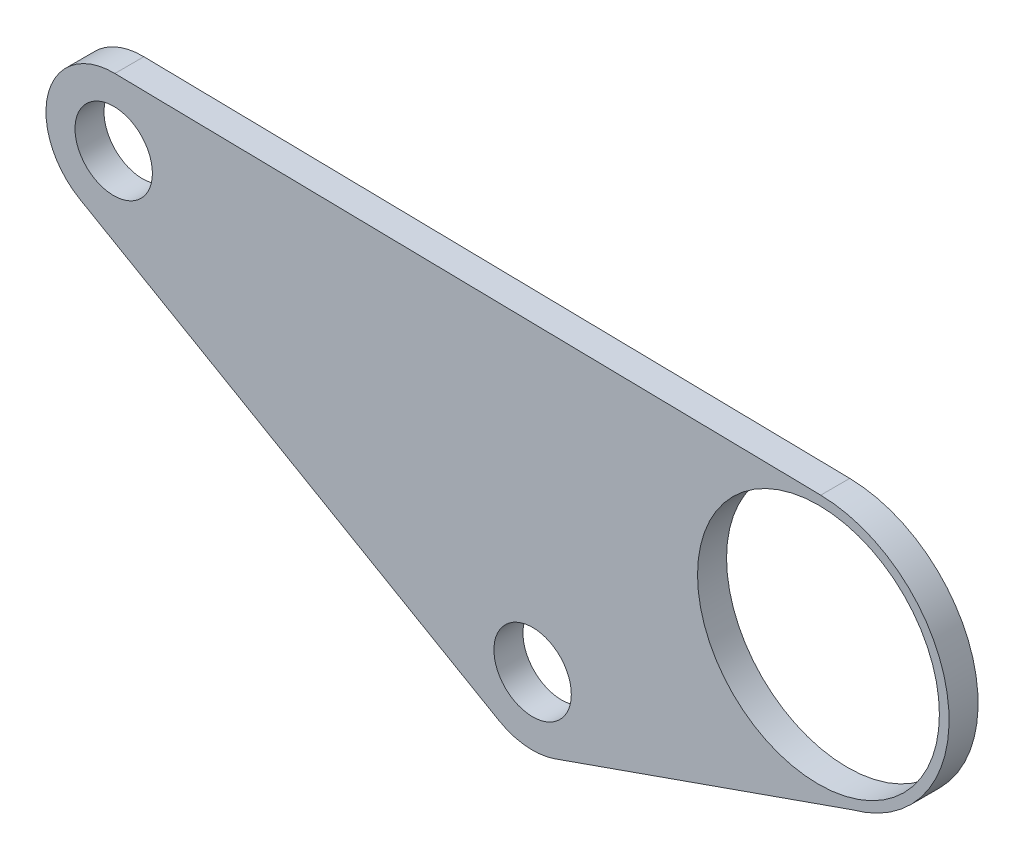
ISO-10303-21;
HEADER;
FILE_DESCRIPTION(('STEP AP214'),'2;1');
FILE_NAME('part.step','',(''),(''),'','','');
FILE_SCHEMA(('AUTOMOTIVE_DESIGN { 1 0 10303 214 1 1 1 1 }'));
ENDSEC;
DATA;
#1=APPLICATION_CONTEXT('core data for automotive mechanical design processes');
#2=APPLICATION_PROTOCOL_DEFINITION('international standard','automotive_design',2000,#1);
#3=PRODUCT_CONTEXT('',#1,'mechanical');
#4=PRODUCT('Part','Part','',(#3));
#5=PRODUCT_RELATED_PRODUCT_CATEGORY('part','',(#4));
#6=PRODUCT_DEFINITION_FORMATION('','',#4);
#7=PRODUCT_DEFINITION_CONTEXT('part definition',#1,'design');
#8=PRODUCT_DEFINITION('design','',#6,#7);
#9=PRODUCT_DEFINITION_SHAPE('','',#8);
#10=(LENGTH_UNIT() NAMED_UNIT(*) SI_UNIT(.MILLI.,.METRE.));
#11=(NAMED_UNIT(*) PLANE_ANGLE_UNIT() SI_UNIT($,.RADIAN.));
#12=(NAMED_UNIT(*) SI_UNIT($,.STERADIAN.) SOLID_ANGLE_UNIT());
#13=UNCERTAINTY_MEASURE_WITH_UNIT(LENGTH_MEASURE(1.E-05),#10,'distance_accuracy_value','');
#14=(GEOMETRIC_REPRESENTATION_CONTEXT(3) GLOBAL_UNCERTAINTY_ASSIGNED_CONTEXT((#13)) GLOBAL_UNIT_ASSIGNED_CONTEXT((#10,
#11,#12)) REPRESENTATION_CONTEXT('',''));
#15=CARTESIAN_POINT('',(0.,0.,0.));
#16=DIRECTION('',(0.,0.,1.));
#17=DIRECTION('',(1.,0.,0.));
#18=AXIS2_PLACEMENT_3D('',#15,#16,#17);
#19=CARTESIAN_POINT('',(83.5750083714108,-201.607395124083,-640.));
#20=DIRECTION('',(0.,0.,-1.));
#21=DIRECTION('',(1.,0.,0.));
#22=AXIS2_PLACEMENT_3D('',#19,#20,#21);
#23=CYLINDRICAL_SURFACE('',#22,6.99999999999999);
#24=CARTESIAN_POINT('',(83.5750083714108,-201.607395124083,-643.));
#25=DIRECTION('',(0.,0.,1.));
#26=DIRECTION('',(1.,0.,0.));
#27=AXIS2_PLACEMENT_3D('',#24,#25,#26);
#28=CIRCLE('',#27,6.99999999999999);
#29=CARTESIAN_POINT('',(83.6965127444625,-194.608449725859,-643.));
#30=VERTEX_POINT('',#29);
#31=CARTESIAN_POINT('',(80.0750083714108,-207.669572950574,-643.));
#32=VERTEX_POINT('',#31);
#33=EDGE_CURVE('E132',#30,#32,#28,.T.);
#34=ORIENTED_EDGE('',*,*,#33,.T.);
#35=DIRECTION('',(0.,0.,-1.));
#36=VECTOR('',#35,1.);
#37=CARTESIAN_POINT('',(80.0750083714108,-207.669572950574,-640.));
#38=LINE('',#37,#36);
#39=CARTESIAN_POINT('',(80.0750083714108,-207.669572950574,-640.));
#40=VERTEX_POINT('',#39);
#41=EDGE_CURVE('E44',#40,#32,#38,.T.);
#42=ORIENTED_EDGE('',*,*,#41,.F.);
#43=CARTESIAN_POINT('',(83.5750083714108,-201.607395124083,-640.));
#44=DIRECTION('',(0.,0.,1.));
#45=DIRECTION('',(1.,0.,0.));
#46=AXIS2_PLACEMENT_3D('',#43,#44,#45);
#47=CIRCLE('',#46,6.99999999999999);
#48=CARTESIAN_POINT('',(83.6965127444625,-194.608449725859,-640.));
#49=VERTEX_POINT('',#48);
#50=EDGE_CURVE('E147',#49,#40,#47,.T.);
#51=ORIENTED_EDGE('',*,*,#50,.F.);
#52=DIRECTION('',(0.,0.,-1.));
#53=VECTOR('',#52,1.);
#54=CARTESIAN_POINT('',(83.6965127444625,-194.608449725859,-640.));
#55=LINE('',#54,#53);
#56=EDGE_CURVE('E11',#49,#30,#55,.T.);
#57=ORIENTED_EDGE('',*,*,#56,.T.);
#58=EDGE_LOOP('',(#34,#42,#51,#57));
#59=FACE_BOUND('',#58,.T.);
#60=ADVANCED_FACE('F41',(#59),#23,.T.);
#61=CARTESIAN_POINT('',(83.6965127444625,-194.608449725859,-640.));
#62=DIRECTION('',(0.0173577675788195,0.999849342603514,0.));
#63=DIRECTION('',(-0.999849342603514,0.0173577675788195,0.));
#64=AXIS2_PLACEMENT_3D('',#61,#62,#63);
#65=PLANE('',#64);
#66=DIRECTION('',(-0.999849342603514,0.0173577675788195,0.));
#67=VECTOR('',#66,1.);
#68=CARTESIAN_POINT('',(83.6965127444625,-194.608449725859,-643.));
#69=LINE('',#68,#67);
#70=CARTESIAN_POINT('',(156.656789284563,-195.875068073951,-643.));
#71=VERTEX_POINT('',#70);
#72=EDGE_CURVE('E89',#71,#30,#69,.T.);
#73=ORIENTED_EDGE('',*,*,#72,.T.);
#74=ORIENTED_EDGE('',*,*,#56,.F.);
#75=DIRECTION('',(-0.999849342603514,0.0173577675788195,0.));
#76=VECTOR('',#75,1.);
#77=CARTESIAN_POINT('',(83.6965127444625,-194.608449725859,-640.));
#78=LINE('',#77,#76);
#79=CARTESIAN_POINT('',(156.656789284563,-195.875068073951,-640.));
#80=VERTEX_POINT('',#79);
#81=EDGE_CURVE('E60',#80,#49,#78,.T.);
#82=ORIENTED_EDGE('',*,*,#81,.F.);
#83=DIRECTION('',(0.,0.,-1.));
#84=VECTOR('',#83,1.);
#85=CARTESIAN_POINT('',(156.656789284563,-195.875068073951,-640.));
#86=LINE('',#85,#84);
#87=EDGE_CURVE('E51',#80,#71,#86,.T.);
#88=ORIENTED_EDGE('',*,*,#87,.T.);
#89=EDGE_LOOP('',(#73,#74,#82,#88));
#90=FACE_BOUND('',#89,.T.);
#91=ADVANCED_FACE('F226',(#90),#65,.T.);
#92=CARTESIAN_POINT('',(156.422459422249,-209.373034199098,-640.));
#93=DIRECTION('',(0.,0.,-1.));
#94=DIRECTION('',(1.,0.,0.));
#95=AXIS2_PLACEMENT_3D('',#92,#93,#94);
#96=CYLINDRICAL_SURFACE('',#95,13.5);
#97=CARTESIAN_POINT('',(156.422459422249,-209.373034199098,-643.));
#98=DIRECTION('',(0.,0.,1.));
#99=DIRECTION('',(1.,0.,0.));
#100=AXIS2_PLACEMENT_3D('',#97,#98,#99);
#101=CIRCLE('',#100,13.5);
#102=CARTESIAN_POINT('',(159.916516531133,-222.413032854001,-643.));
#103=VERTEX_POINT('',#102);
#104=EDGE_CURVE('E83',#103,#71,#101,.T.);
#105=ORIENTED_EDGE('',*,*,#104,.T.);
#106=ORIENTED_EDGE('',*,*,#87,.F.);
#107=CARTESIAN_POINT('',(156.422459422249,-209.373034199098,-640.));
#108=DIRECTION('',(0.,0.,1.));
#109=DIRECTION('',(1.,0.,0.));
#110=AXIS2_PLACEMENT_3D('',#107,#108,#109);
#111=CIRCLE('',#110,13.5);
#112=CARTESIAN_POINT('',(159.916516531133,-222.413032854001,-640.));
#113=VERTEX_POINT('',#112);
#114=EDGE_CURVE('E108',#113,#80,#111,.T.);
#115=ORIENTED_EDGE('',*,*,#114,.F.);
#116=DIRECTION('',(0.,0.,-1.));
#117=VECTOR('',#116,1.);
#118=CARTESIAN_POINT('',(159.916516531133,-222.413032854001,-640.));
#119=LINE('',#118,#117);
#120=EDGE_CURVE('E116',#113,#103,#119,.T.);
#121=ORIENTED_EDGE('',*,*,#120,.T.);
#122=EDGE_LOOP('',(#105,#106,#115,#121));
#123=FACE_BOUND('',#122,.T.);
#124=ADVANCED_FACE('F123',(#123),#96,.T.);
#125=CARTESIAN_POINT('',(129.197661631948,-233.211271306766,-640.));
#126=DIRECTION('',(0.331626153045014,-0.943410883240471,0.));
#127=DIRECTION('',(0.943410883240471,0.331626153045014,0.));
#128=AXIS2_PLACEMENT_3D('',#125,#126,#127);
#129=PLANE('',#128);
#130=DIRECTION('',(0.943410883240471,0.331626153045014,0.));
#131=VECTOR('',#130,1.);
#132=CARTESIAN_POINT('',(129.197661631948,-233.211271306766,-643.));
#133=LINE('',#132,#131);
#134=CARTESIAN_POINT('',(129.197661631948,-233.211271306766,-643.));
#135=VERTEX_POINT('',#134);
#136=EDGE_CURVE('E119',#135,#103,#133,.T.);
#137=ORIENTED_EDGE('',*,*,#136,.T.);
#138=ORIENTED_EDGE('',*,*,#120,.F.);
#139=DIRECTION('',(0.943410883240471,0.331626153045014,0.));
#140=VECTOR('',#139,1.);
#141=CARTESIAN_POINT('',(129.197661631948,-233.211271306766,-640.));
#142=LINE('',#141,#140);
#143=CARTESIAN_POINT('',(129.197661631948,-233.211271306766,-640.));
#144=VERTEX_POINT('',#143);
#145=EDGE_CURVE('E104',#144,#113,#142,.T.);
#146=ORIENTED_EDGE('',*,*,#145,.F.);
#147=DIRECTION('',(0.,0.,-1.));
#148=VECTOR('',#147,1.);
#149=CARTESIAN_POINT('',(129.197661631948,-233.211271306766,-640.));
#150=LINE('',#149,#148);
#151=EDGE_CURVE('E121',#144,#135,#150,.T.);
#152=ORIENTED_EDGE('',*,*,#151,.T.);
#153=EDGE_LOOP('',(#137,#138,#146,#152));
#154=FACE_BOUND('',#153,.T.);
#155=ADVANCED_FACE('F117',(#154),#129,.T.);
#156=CARTESIAN_POINT('',(126.876278560633,-226.607395124083,-640.));
#157=DIRECTION('',(0.,0.,-1.));
#158=DIRECTION('',(1.,0.,0.));
#159=AXIS2_PLACEMENT_3D('',#156,#157,#158);
#160=CYLINDRICAL_SURFACE('',#159,6.99999999999999);
#161=CARTESIAN_POINT('',(126.876278560633,-226.607395124083,-643.));
#162=DIRECTION('',(0.,0.,1.));
#163=DIRECTION('',(1.,0.,0.));
#164=AXIS2_PLACEMENT_3D('',#161,#162,#163);
#165=CIRCLE('',#164,6.99999999999999);
#166=CARTESIAN_POINT('',(123.376278560633,-232.669572950574,-643.));
#167=VERTEX_POINT('',#166);
#168=EDGE_CURVE('E140',#167,#135,#165,.T.);
#169=ORIENTED_EDGE('',*,*,#168,.T.);
#170=ORIENTED_EDGE('',*,*,#151,.F.);
#171=CARTESIAN_POINT('',(126.876278560633,-226.607395124083,-640.));
#172=DIRECTION('',(0.,0.,1.));
#173=DIRECTION('',(1.,0.,0.));
#174=AXIS2_PLACEMENT_3D('',#171,#172,#173);
#175=CIRCLE('',#174,6.99999999999999);
#176=CARTESIAN_POINT('',(123.376278560633,-232.669572950574,-640.));
#177=VERTEX_POINT('',#176);
#178=EDGE_CURVE('E110',#177,#144,#175,.T.);
#179=ORIENTED_EDGE('',*,*,#178,.F.);
#180=DIRECTION('',(0.,0.,-1.));
#181=VECTOR('',#180,1.);
#182=CARTESIAN_POINT('',(123.376278560633,-232.669572950574,-640.));
#183=LINE('',#182,#181);
#184=EDGE_CURVE('E152',#177,#167,#183,.T.);
#185=ORIENTED_EDGE('',*,*,#184,.T.);
#186=EDGE_LOOP('',(#169,#170,#179,#185));
#187=FACE_BOUND('',#186,.T.);
#188=ADVANCED_FACE('F169',(#187),#160,.T.);
#189=CARTESIAN_POINT('',(80.0750083714108,-207.669572950574,-640.));
#190=DIRECTION('',(-0.499999999999996,-0.866025403784441,0.));
#191=DIRECTION('',(0.866025403784441,-0.499999999999996,0.));
#192=AXIS2_PLACEMENT_3D('',#189,#190,#191);
#193=PLANE('',#192);
#194=DIRECTION('',(0.866025403784441,-0.499999999999996,0.));
#195=VECTOR('',#194,1.);
#196=CARTESIAN_POINT('',(80.0750083714108,-207.669572950574,-643.));
#197=LINE('',#196,#195);
#198=EDGE_CURVE('E136',#32,#167,#197,.T.);
#199=ORIENTED_EDGE('',*,*,#198,.T.);
#200=ORIENTED_EDGE('',*,*,#184,.F.);
#201=DIRECTION('',(0.866025403784441,-0.499999999999996,0.));
#202=VECTOR('',#201,1.);
#203=CARTESIAN_POINT('',(80.0750083714108,-207.669572950574,-640.));
#204=LINE('',#203,#202);
#205=EDGE_CURVE('E97',#40,#177,#204,.T.);
#206=ORIENTED_EDGE('',*,*,#205,.F.);
#207=ORIENTED_EDGE('',*,*,#41,.T.);
#208=EDGE_LOOP('',(#199,#200,#206,#207));
#209=FACE_BOUND('',#208,.T.);
#210=ADVANCED_FACE('F163',(#209),#193,.T.);
#211=CARTESIAN_POINT('',(83.5750083714108,-201.607395124083,-640.));
#212=DIRECTION('',(0.,0.,-1.));
#213=DIRECTION('',(1.,0.,0.));
#214=AXIS2_PLACEMENT_3D('',#211,#212,#213);
#215=PLANE('',#214);
#216=CARTESIAN_POINT('',(156.422459422249,-209.373034199098,-640.));
#217=DIRECTION('',(0.,0.,1.));
#218=DIRECTION('',(1.,0.,0.));
#219=AXIS2_PLACEMENT_3D('',#216,#217,#218);
#220=CIRCLE('',#219,12.5);
#221=CARTESIAN_POINT('',(168.922459422249,-209.373034199098,-640.));
#222=VERTEX_POINT('',#221);
#223=EDGE_CURVE('E187',#222,#222,#220,.T.);
#224=ORIENTED_EDGE('',*,*,#223,.F.);
#225=EDGE_LOOP('',(#224));
#226=FACE_BOUND('',#225,.T.);
#227=CARTESIAN_POINT('',(126.876278560633,-226.607395124083,-640.));
#228=DIRECTION('',(0.,0.,1.));
#229=DIRECTION('',(1.,0.,0.));
#230=AXIS2_PLACEMENT_3D('',#227,#228,#229);
#231=CIRCLE('',#230,3.99999999999997);
#232=CARTESIAN_POINT('',(130.876278560633,-226.607395124083,-640.));
#233=VERTEX_POINT('',#232);
#234=EDGE_CURVE('E179',#233,#233,#231,.T.);
#235=ORIENTED_EDGE('',*,*,#234,.F.);
#236=EDGE_LOOP('',(#235));
#237=FACE_BOUND('',#236,.T.);
#238=CARTESIAN_POINT('',(83.5750083714108,-201.607395124083,-640.));
#239=DIRECTION('',(0.,0.,1.));
#240=DIRECTION('',(1.,0.,0.));
#241=AXIS2_PLACEMENT_3D('',#238,#239,#240);
#242=CIRCLE('',#241,4.00000000000001);
#243=CARTESIAN_POINT('',(87.5750083714108,-201.607395124083,-640.));
#244=VERTEX_POINT('',#243);
#245=EDGE_CURVE('E137',#244,#244,#242,.T.);
#246=ORIENTED_EDGE('',*,*,#245,.F.);
#247=EDGE_LOOP('',(#246));
#248=FACE_BOUND('',#247,.T.);
#249=ORIENTED_EDGE('',*,*,#50,.T.);
#250=ORIENTED_EDGE('',*,*,#205,.T.);
#251=ORIENTED_EDGE('',*,*,#178,.T.);
#252=ORIENTED_EDGE('',*,*,#145,.T.);
#253=ORIENTED_EDGE('',*,*,#114,.T.);
#254=ORIENTED_EDGE('',*,*,#81,.T.);
#255=EDGE_LOOP('',(#249,#250,#251,#252,#253,#254));
#256=FACE_BOUND('',#255,.T.);
#257=ADVANCED_FACE('F106',(#226,#237,#248,#256),#215,.F.);
#258=CARTESIAN_POINT('',(83.5750083714108,-201.607395124083,-643.));
#259=DIRECTION('',(0.,0.,-1.));
#260=DIRECTION('',(1.,0.,0.));
#261=AXIS2_PLACEMENT_3D('',#258,#259,#260);
#262=PLANE('',#261);
#263=CARTESIAN_POINT('',(156.422459422249,-209.373034199098,-643.));
#264=DIRECTION('',(0.,0.,1.));
#265=DIRECTION('',(1.,0.,0.));
#266=AXIS2_PLACEMENT_3D('',#263,#264,#265);
#267=CIRCLE('',#266,12.5);
#268=CARTESIAN_POINT('',(168.922459422249,-209.373034199098,-643.));
#269=VERTEX_POINT('',#268);
#270=EDGE_CURVE('E191',#269,#269,#267,.T.);
#271=ORIENTED_EDGE('',*,*,#270,.T.);
#272=EDGE_LOOP('',(#271));
#273=FACE_BOUND('',#272,.T.);
#274=CARTESIAN_POINT('',(126.876278560633,-226.607395124083,-643.));
#275=DIRECTION('',(0.,0.,1.));
#276=DIRECTION('',(1.,0.,0.));
#277=AXIS2_PLACEMENT_3D('',#274,#275,#276);
#278=CIRCLE('',#277,3.99999999999997);
#279=CARTESIAN_POINT('',(130.876278560633,-226.607395124083,-643.));
#280=VERTEX_POINT('',#279);
#281=EDGE_CURVE('E183',#280,#280,#278,.T.);
#282=ORIENTED_EDGE('',*,*,#281,.T.);
#283=EDGE_LOOP('',(#282));
#284=FACE_BOUND('',#283,.T.);
#285=CARTESIAN_POINT('',(83.5750083714108,-201.607395124083,-643.));
#286=DIRECTION('',(0.,0.,1.));
#287=DIRECTION('',(1.,0.,0.));
#288=AXIS2_PLACEMENT_3D('',#285,#286,#287);
#289=CIRCLE('',#288,4.00000000000001);
#290=CARTESIAN_POINT('',(87.5750083714108,-201.607395124083,-643.));
#291=VERTEX_POINT('',#290);
#292=EDGE_CURVE('E175',#291,#291,#289,.T.);
#293=ORIENTED_EDGE('',*,*,#292,.T.);
#294=EDGE_LOOP('',(#293));
#295=FACE_BOUND('',#294,.T.);
#296=ORIENTED_EDGE('',*,*,#33,.F.);
#297=ORIENTED_EDGE('',*,*,#72,.F.);
#298=ORIENTED_EDGE('',*,*,#104,.F.);
#299=ORIENTED_EDGE('',*,*,#136,.F.);
#300=ORIENTED_EDGE('',*,*,#168,.F.);
#301=ORIENTED_EDGE('',*,*,#198,.F.);
#302=EDGE_LOOP('',(#296,#297,#298,#299,#300,#301));
#303=FACE_BOUND('',#302,.T.);
#304=ADVANCED_FACE('F168',(#273,#284,#295,#303),#262,.T.);
#305=CARTESIAN_POINT('',(83.5750083714108,-201.607395124083,-640.));
#306=DIRECTION('',(0.,0.,-1.));
#307=DIRECTION('',(1.,0.,0.));
#308=AXIS2_PLACEMENT_3D('',#305,#306,#307);
#309=CYLINDRICAL_SURFACE('',#308,4.00000000000001);
#310=ORIENTED_EDGE('',*,*,#245,.T.);
#311=EDGE_LOOP('',(#310));
#312=FACE_BOUND('',#311,.T.);
#313=ORIENTED_EDGE('',*,*,#292,.F.);
#314=EDGE_LOOP('',(#313));
#315=FACE_BOUND('',#314,.T.);
#316=ADVANCED_FACE('F210',(#312,#315),#309,.F.);
#317=CARTESIAN_POINT('',(126.876278560633,-226.607395124083,-640.));
#318=DIRECTION('',(0.,0.,-1.));
#319=DIRECTION('',(1.,0.,0.));
#320=AXIS2_PLACEMENT_3D('',#317,#318,#319);
#321=CYLINDRICAL_SURFACE('',#320,3.99999999999997);
#322=ORIENTED_EDGE('',*,*,#234,.T.);
#323=EDGE_LOOP('',(#322));
#324=FACE_BOUND('',#323,.T.);
#325=ORIENTED_EDGE('',*,*,#281,.F.);
#326=EDGE_LOOP('',(#325));
#327=FACE_BOUND('',#326,.T.);
#328=ADVANCED_FACE('F213',(#324,#327),#321,.F.);
#329=CARTESIAN_POINT('',(156.422459422249,-209.373034199098,-640.));
#330=DIRECTION('',(0.,0.,-1.));
#331=DIRECTION('',(1.,0.,0.));
#332=AXIS2_PLACEMENT_3D('',#329,#330,#331);
#333=CYLINDRICAL_SURFACE('',#332,12.5);
#334=ORIENTED_EDGE('',*,*,#223,.T.);
#335=EDGE_LOOP('',(#334));
#336=FACE_BOUND('',#335,.T.);
#337=ORIENTED_EDGE('',*,*,#270,.F.);
#338=EDGE_LOOP('',(#337));
#339=FACE_BOUND('',#338,.T.);
#340=ADVANCED_FACE('F200',(#336,#339),#333,.F.);
#341=CLOSED_SHELL('',(#60,#91,#124,#155,#188,#210,#257,#304,#316,#328,#340));
#342=MANIFOLD_SOLID_BREP('B2',#341);
#343=ADVANCED_BREP_SHAPE_REPRESENTATION('',(#18,#342),#14);
#344=SHAPE_DEFINITION_REPRESENTATION(#9,#343);
ENDSEC;
END-ISO-10303-21;
